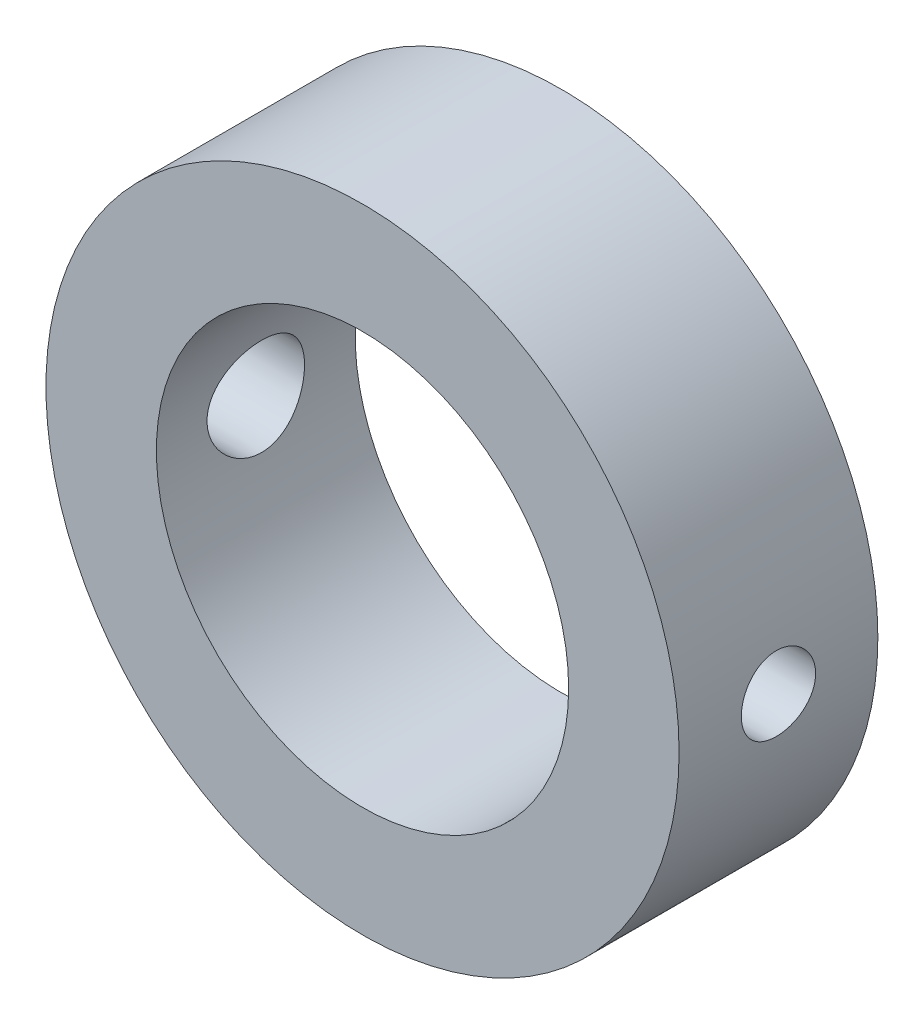
ISO-10303-21;
HEADER;
FILE_DESCRIPTION(('STEP AP214'),'2;1');
FILE_NAME('part.step','',(''),(''),'','','');
FILE_SCHEMA(('AUTOMOTIVE_DESIGN { 1 0 10303 214 1 1 1 1 }'));
ENDSEC;
DATA;
#1=APPLICATION_CONTEXT('core data for automotive mechanical design processes');
#2=APPLICATION_PROTOCOL_DEFINITION('international standard','automotive_design',2000,#1);
#3=PRODUCT_CONTEXT('',#1,'mechanical');
#4=PRODUCT('Part','Part','',(#3));
#5=PRODUCT_RELATED_PRODUCT_CATEGORY('part','',(#4));
#6=PRODUCT_DEFINITION_FORMATION('','',#4);
#7=PRODUCT_DEFINITION_CONTEXT('part definition',#1,'design');
#8=PRODUCT_DEFINITION('design','',#6,#7);
#9=PRODUCT_DEFINITION_SHAPE('','',#8);
#10=(LENGTH_UNIT() NAMED_UNIT(*) SI_UNIT(.MILLI.,.METRE.));
#11=(NAMED_UNIT(*) PLANE_ANGLE_UNIT() SI_UNIT($,.RADIAN.));
#12=(NAMED_UNIT(*) SI_UNIT($,.STERADIAN.) SOLID_ANGLE_UNIT());
#13=UNCERTAINTY_MEASURE_WITH_UNIT(LENGTH_MEASURE(1.E-05),#10,'distance_accuracy_value','');
#14=(GEOMETRIC_REPRESENTATION_CONTEXT(3) GLOBAL_UNCERTAINTY_ASSIGNED_CONTEXT((#13)) GLOBAL_UNIT_ASSIGNED_CONTEXT((#10,
#11,#12)) REPRESENTATION_CONTEXT('',''));
#15=CARTESIAN_POINT('',(0.,0.,0.));
#16=DIRECTION('',(0.,0.,1.));
#17=DIRECTION('',(1.,0.,0.));
#18=AXIS2_PLACEMENT_3D('',#15,#16,#17);
#19=CARTESIAN_POINT('',(0.,0.,13.5));
#20=DIRECTION('',(0.,0.,1.));
#21=DIRECTION('',(1.,0.,0.));
#22=AXIS2_PLACEMENT_3D('',#19,#20,#21);
#23=PLANE('',#22);
#24=CARTESIAN_POINT('',(0.,0.,13.5));
#25=DIRECTION('',(0.,0.,1.));
#26=DIRECTION('',(1.,0.,0.));
#27=AXIS2_PLACEMENT_3D('',#24,#25,#26);
#28=CIRCLE('',#27,43.);
#29=CARTESIAN_POINT('',(43.,0.,13.5));
#30=VERTEX_POINT('',#29);
#31=EDGE_CURVE('E10',#30,#30,#28,.T.);
#32=ORIENTED_EDGE('',*,*,#31,.T.);
#33=EDGE_LOOP('',(#32));
#34=FACE_BOUND('',#33,.T.);
#35=CARTESIAN_POINT('',(0.,0.,13.5));
#36=DIRECTION('',(0.,0.,1.));
#37=DIRECTION('',(1.,0.,0.));
#38=AXIS2_PLACEMENT_3D('',#35,#36,#37);
#39=CIRCLE('',#38,28.);
#40=CARTESIAN_POINT('',(28.,0.,13.5));
#41=VERTEX_POINT('',#40);
#42=EDGE_CURVE('E50',#41,#41,#39,.T.);
#43=ORIENTED_EDGE('',*,*,#42,.F.);
#44=EDGE_LOOP('',(#43));
#45=FACE_BOUND('',#44,.T.);
#46=ADVANCED_FACE('F31',(#34,#45),#23,.T.);
#47=CARTESIAN_POINT('',(0.,0.,-13.5));
#48=DIRECTION('',(0.,0.,1.));
#49=DIRECTION('',(1.,0.,0.));
#50=AXIS2_PLACEMENT_3D('',#47,#48,#49);
#51=PLANE('',#50);
#52=CARTESIAN_POINT('',(0.,0.,-13.5));
#53=DIRECTION('',(0.,0.,1.));
#54=DIRECTION('',(1.,0.,0.));
#55=AXIS2_PLACEMENT_3D('',#52,#53,#54);
#56=CIRCLE('',#55,43.);
#57=CARTESIAN_POINT('',(43.,0.,-13.5));
#58=VERTEX_POINT('',#57);
#59=EDGE_CURVE('E45',#58,#58,#56,.T.);
#60=ORIENTED_EDGE('',*,*,#59,.F.);
#61=EDGE_LOOP('',(#60));
#62=FACE_BOUND('',#61,.T.);
#63=CARTESIAN_POINT('',(0.,0.,-13.5));
#64=DIRECTION('',(0.,0.,1.));
#65=DIRECTION('',(1.,0.,0.));
#66=AXIS2_PLACEMENT_3D('',#63,#64,#65);
#67=CIRCLE('',#66,28.);
#68=CARTESIAN_POINT('',(28.,0.,-13.5));
#69=VERTEX_POINT('',#68);
#70=EDGE_CURVE('E53',#69,#69,#67,.T.);
#71=ORIENTED_EDGE('',*,*,#70,.T.);
#72=EDGE_LOOP('',(#71));
#73=FACE_BOUND('',#72,.T.);
#74=ADVANCED_FACE('F89',(#62,#73),#51,.F.);
#75=CARTESIAN_POINT('',(0.,0.,13.5));
#76=DIRECTION('',(0.,0.,-1.));
#77=DIRECTION('',(-1.,0.,0.));
#78=AXIS2_PLACEMENT_3D('',#75,#76,#77);
#79=CYLINDRICAL_SURFACE('',#78,43.);
#80=CARTESIAN_POINT('',(-42.7005537326384,-5.06583763321157,-4.75652361275826));
#81=CARTESIAN_POINT('',(-42.7163477142971,-4.93270891768627,-4.89882605603567));
#82=CARTESIAN_POINT('',(-42.7322168758354,-4.79362168722898,-5.03549192619008));
#83=CARTESIAN_POINT('',(-42.7636713832663,-4.50439373459468,-5.29670866597223));
#84=CARTESIAN_POINT('',(-42.7792566725748,-4.35425083813588,-5.42125714127135));
#85=CARTESIAN_POINT('',(-42.809711163048,-4.04387900362388,-5.65738814795436));
#86=CARTESIAN_POINT('',(-42.8245799023085,-3.88364370932299,-5.76896237962437));
#87=CARTESIAN_POINT('',(-42.8531786999786,-3.55421087977092,-5.9782990047526));
#88=CARTESIAN_POINT('',(-42.8669083482935,-3.38501015240699,-6.0760564327303));
#89=CARTESIAN_POINT('',(-42.892835023297,-3.03888405901492,-6.25699185876266));
#90=CARTESIAN_POINT('',(-42.9050321389534,-2.86195914220175,-6.34017070325558));
#91=CARTESIAN_POINT('',(-42.927549447541,-2.50161599003928,-6.49133653232323));
#92=CARTESIAN_POINT('',(-42.9378696320379,-2.31819772551478,-6.55932344862923));
#93=CARTESIAN_POINT('',(-42.9563369786926,-1.94622142896929,-6.67957144867405));
#94=CARTESIAN_POINT('',(-42.9644847018377,-1.75766473771525,-6.73183659263974));
#95=CARTESIAN_POINT('',(-42.9783778911905,-1.37672026031294,-6.82025985793493));
#96=CARTESIAN_POINT('',(-42.9841233231778,-1.18433241963132,-6.85641774981907));
#97=CARTESIAN_POINT('',(-42.9930049388914,-0.798952513846375,-6.91207729890392));
#98=CARTESIAN_POINT('',(-42.9961651628126,-0.605983163174101,-6.93173246347314));
#99=CARTESIAN_POINT('',(-42.9998779449146,-0.218983392092987,-6.95480764218464));
#100=CARTESIAN_POINT('',(-43.0004296028116,-0.0249526284897197,-6.9582220512225));
#101=CARTESIAN_POINT('',(-42.9989074538579,0.362629719975974,-6.94877534769905));
#102=CARTESIAN_POINT('',(-42.9968346171285,0.556181455415051,-6.9359202490183));
#103=CARTESIAN_POINT('',(-42.9901224583996,0.941554468225401,-6.89403764924919));
#104=CARTESIAN_POINT('',(-42.9854821888631,1.13337508012915,-6.86500417733982));
#105=CARTESIAN_POINT('',(-42.9738095772135,1.5124066684979,-6.79126491279672));
#106=CARTESIAN_POINT('',(-42.9667954637269,1.6996414463433,-6.7466784728129));
#107=CARTESIAN_POINT('',(-42.9505589327536,2.06973695286103,-6.64211179283036));
#108=CARTESIAN_POINT('',(-42.9413357088613,2.25259605738132,-6.58212593090902));
#109=CARTESIAN_POINT('',(-42.9209401860587,2.6125430124186,-6.44723677970186));
#110=CARTESIAN_POINT('',(-42.9097685397516,2.78963277182098,-6.37233848399163));
#111=CARTESIAN_POINT('',(-42.8857761675203,3.13696054904402,-6.20812715531531));
#112=CARTESIAN_POINT('',(-42.8729548281882,3.30719598714165,-6.11880875733702));
#113=CARTESIAN_POINT('',(-42.8459127026584,3.64087935291196,-5.92567074068454));
#114=CARTESIAN_POINT('',(-42.8316818935123,3.80426486567724,-5.82174467765523));
#115=CARTESIAN_POINT('',(-42.80229305683,4.12178927330786,-5.60062116341088));
#116=CARTESIAN_POINT('',(-42.7871346888704,4.27592473170252,-5.48341882607448));
#117=CARTESIAN_POINT('',(-42.7563174878935,4.57380914789874,-5.23661172412136));
#118=CARTESIAN_POINT('',(-42.7406588063775,4.71756120773187,-5.10701069072479));
#119=CARTESIAN_POINT('',(-42.709267263405,4.99377931167161,-4.83627508615798));
#120=CARTESIAN_POINT('',(-42.6935343765602,5.12624114472699,-4.69513624971417));
#121=CARTESIAN_POINT('',(-42.6465300316945,5.50815187385395,-4.25246951442392));
#122=CARTESIAN_POINT('',(-42.6157994436739,5.73891330775047,-3.93435293771481));
#123=CARTESIAN_POINT('',(-42.5593300301592,6.14373451377144,-3.26370479149895));
#124=CARTESIAN_POINT('',(-42.533591158311,6.31779481244524,-2.9111735416201));
#125=CARTESIAN_POINT('',(-42.4900654055851,6.60419513999488,-2.18176409086996));
#126=CARTESIAN_POINT('',(-42.4722702134176,6.71659970616295,-1.80491181144252));
#127=CARTESIAN_POINT('',(-42.4466757291218,6.87650957727948,-1.03737326404777));
#128=CARTESIAN_POINT('',(-42.438875676449,6.92401982014913,-0.646688050973389));
#129=CARTESIAN_POINT('',(-42.4342114387742,6.95254617164813,0.13303979740889));
#130=CARTESIAN_POINT('',(-42.4372330418092,6.93425672220834,0.522056457103814));
#131=CARTESIAN_POINT('',(-42.4536074165497,6.83328505587877,1.29140746802592));
#132=CARTESIAN_POINT('',(-42.4669600945035,6.75060342333027,1.6717418980097));
#133=CARTESIAN_POINT('',(-42.5024239416409,6.5235736539131,2.41219735408853));
#134=CARTESIAN_POINT('',(-42.5245165077609,6.37935644610632,2.77235947057431));
#135=CARTESIAN_POINT('',(-42.5749704925141,6.03343181523057,3.46345152452207));
#136=CARTESIAN_POINT('',(-42.6033323274233,5.83172057433244,3.79437951881149));
#137=CARTESIAN_POINT('',(-42.6634737880328,5.37416077077464,4.42110600576054));
#138=CARTESIAN_POINT('',(-42.6952842097319,5.11780058719192,4.71652807582918));
#139=CARTESIAN_POINT('',(-42.7585377993643,4.55919812584389,5.26030354673888));
#140=CARTESIAN_POINT('',(-42.7899809523067,4.25695398224773,5.50865503257221));
#141=CARTESIAN_POINT('',(-42.8491599699604,3.61308688567512,5.95251544579699));
#142=CARTESIAN_POINT('',(-42.8768748758372,3.27125989894034,6.14773147142776));
#143=CARTESIAN_POINT('',(-42.9252611298293,2.55913090516088,6.47776816482238));
#144=CARTESIAN_POINT('',(-42.9459329276022,2.18883071779952,6.61259268837209));
#145=CARTESIAN_POINT('',(-42.9777334585083,1.43381580453318,6.81678797463098));
#146=CARTESIAN_POINT('',(-42.9889470025088,1.04926217941175,6.88674100809512));
#147=CARTESIAN_POINT('',(-43.0008765395708,0.273706913386378,6.96109179599217));
#148=CARTESIAN_POINT('',(-43.0015933166557,-0.117294243755138,6.96549444650822));
#149=CARTESIAN_POINT('',(-42.9925075583907,-0.889993939428825,6.90896956730961));
#150=CARTESIAN_POINT('',(-42.9828212935386,-1.27174753716035,6.84876414139727));
#151=CARTESIAN_POINT('',(-42.9541647117393,-2.01982295996605,6.66588044137355));
#152=CARTESIAN_POINT('',(-42.935194239684,-2.38614452711156,6.54320112353106));
#153=CARTESIAN_POINT('',(-42.9013496600983,-2.9165132070068,6.31510856135504));
#154=CARTESIAN_POINT('',(-42.8891405030438,-3.09044172895857,6.23152310023267));
#155=CARTESIAN_POINT('',(-42.8632674728434,-3.43064149443909,6.05022910127554));
#156=CARTESIAN_POINT('',(-42.8496041173996,-3.59691543303934,5.95252558513867));
#157=CARTESIAN_POINT('',(-42.8211883329577,-3.92075182527211,5.74363640086512));
#158=CARTESIAN_POINT('',(-42.8064354426985,-4.07831053931872,5.63244500960731));
#159=CARTESIAN_POINT('',(-42.7762552988375,-4.38354773446006,5.39742545393037));
#160=CARTESIAN_POINT('',(-42.7608282844426,-4.53122967391877,5.27360175148989));
#161=CARTESIAN_POINT('',(-42.729513676828,-4.81764378889772,5.01243756652414));
#162=CARTESIAN_POINT('',(-42.7136226999927,-4.95623394835483,4.87494172044946));
#163=CARTESIAN_POINT('',(-42.6820289508073,-5.22132367301294,4.58882402868624));
#164=CARTESIAN_POINT('',(-42.6663261129924,-5.34782755730743,4.44020619161202));
#165=CARTESIAN_POINT('',(-42.6355390029776,-5.58797638330125,4.13276343602957));
#166=CARTESIAN_POINT('',(-42.6204549811323,-5.70161615264222,3.97393445181963));
#167=CARTESIAN_POINT('',(-42.5913452620942,-5.91514326250388,3.64727925122618));
#168=CARTESIAN_POINT('',(-42.5773191726076,-6.01503571213652,3.47945640975104));
#169=CARTESIAN_POINT('',(-42.5506545861169,-6.20085901525531,3.13508482172751));
#170=CARTESIAN_POINT('',(-42.5380231593957,-6.2867197020903,2.95849765310593));
#171=CARTESIAN_POINT('',(-42.5145977186562,-6.44323244926257,2.59866314968147));
#172=CARTESIAN_POINT('',(-42.5038030577857,-6.51388986605133,2.41541818725214));
#173=CARTESIAN_POINT('',(-42.4843605742948,-6.63951434911613,2.04349264274926));
#174=CARTESIAN_POINT('',(-42.4757129813666,-6.69447973676234,1.854811481522));
#175=CARTESIAN_POINT('',(-42.4608215662475,-6.78829071457594,1.47339543938932));
#176=CARTESIAN_POINT('',(-42.4545776654502,-6.8271368318846,1.28066069126314));
#177=CARTESIAN_POINT('',(-42.4447235506245,-6.88813396682107,0.894294461705327));
#178=CARTESIAN_POINT('',(-42.4410899628025,-6.91043321275083,0.70068696879016));
#179=CARTESIAN_POINT('',(-42.4364712196046,-6.93874032714306,0.312256620904995));
#180=CARTESIAN_POINT('',(-42.4354860062117,-6.94474855248691,0.117433792652614));
#181=CARTESIAN_POINT('',(-42.4361929382048,-6.94042747468007,-0.272091059641655));
#182=CARTESIAN_POINT('',(-42.4378859835438,-6.93009267991946,-0.466793021075163));
#183=CARTESIAN_POINT('',(-42.4439002640215,-6.89316176428747,-0.85453456607113));
#184=CARTESIAN_POINT('',(-42.4482205267315,-6.8665716600775,-1.04757473792393));
#185=CARTESIAN_POINT('',(-42.4593278677754,-6.79755018203065,-1.42950935307062));
#186=CARTESIAN_POINT('',(-42.4660997149843,-6.75521657559763,-1.61842191846674));
#187=CARTESIAN_POINT('',(-42.4819159631627,-6.65502698490722,-1.99191247960682));
#188=CARTESIAN_POINT('',(-42.4909595479354,-6.59717657506912,-2.17649200615013));
#189=CARTESIAN_POINT('',(-42.5110571562871,-6.46640471875321,-2.54000279911698));
#190=CARTESIAN_POINT('',(-42.5221100091405,-6.39349204513934,-2.7189372838188));
#191=CARTESIAN_POINT('',(-42.5459122947484,-6.23312988277321,-3.06998702159453));
#192=CARTESIAN_POINT('',(-42.5586614149867,-6.14568307101798,-3.24210352323521));
#193=CARTESIAN_POINT('',(-42.5914909061707,-5.91472246242306,-3.65339526876705));
#194=CARTESIAN_POINT('',(-42.6123068269294,-5.76358750614786,-3.88828086508098));
#195=CARTESIAN_POINT('',(-42.6555485079447,-5.43430723789612,-4.33812576837739));
#196=CARTESIAN_POINT('',(-42.6779742931483,-5.25616150730101,-4.55308476645011));
#197=CARTESIAN_POINT('',(-42.7005537326384,-5.06583763321157,-4.75652361275826));
#198=B_SPLINE_CURVE_WITH_KNOTS('',3,(#80,#81,#82,#83,#84,#85,#86,#87,#88,#89,#90,#91,#92,#93,
#94,#95,#96,#97,#98,#99,#100,#101,#102,#103,#104,#105,#106,#107,#108,#109,#110,#111,#112,#113,
#114,#115,#116,#117,#118,#119,#120,#121,#122,#123,#124,#125,#126,#127,#128,#129,#130,#131,#132,
#133,#134,#135,#136,#137,#138,#139,#140,#141,#142,#143,#144,#145,#146,#147,#148,#149,#150,#151,
#152,#153,#154,#155,#156,#157,#158,#159,#160,#161,#162,#163,#164,#165,#166,#167,#168,#169,#170,
#171,#172,#173,#174,#175,#176,#177,#178,#179,#180,#181,#182,#183,#184,#185,#186,#187,#188,#189,
#190,#191,#192,#193,#194,#195,#196,#197),.UNSPECIFIED.,.T.,.F.,(4,2,2,2,2,2,2,2,2,2,2,2,2,2,2,2,
2,2,2,2,2,2,2,2,2,2,2,2,2,2,2,2,2,2,2,2,2,2,2,2,2,2,2,2,2,2,2,2,2,2,2,2,2,2,2,2,2,2,4),(0.,
0.586279381729272,1.17267437466221,1.75944244858957,2.34642086183849,2.93336518359362,
3.52031214287664,4.10710738975487,4.69391099517486,5.27519373687236,5.85667707971634,
6.43794554511571,7.01942867677223,7.59654429143831,8.17387089615041,8.75100450151222,
9.32835332689378,9.91015128557391,10.4921640657047,11.0740022446264,11.6560564976213,
12.8325686179175,14.0090698123412,15.1843371587282,16.3595150720089,17.5223268548681,
18.6851280856546,19.8454674690084,21.0058839214036,22.1776828034979,23.349529348533,
24.5277104076118,25.7058162332317,26.8732423142677,28.0405811975856,29.1950076923386,
30.3494534743546,30.928970664335,31.5082822290194,32.0878404704055,32.6671947046726,
33.2541127258479,33.8408202181033,34.4277627799923,35.0144866155767,35.6040601166074,
36.1934255563653,36.7828540189489,37.3722632041984,37.9563264695242,38.5403769398882,
39.1246237056081,39.7086543518844,40.2891171279131,40.8693716510579,41.4492891588773,
42.0290999716502,42.8672454709393,43.7054039613085),.UNSPECIFIED.);
#199=CARTESIAN_POINT('',(-42.7005537326384,-5.06583763321157,-4.75652361275826));
#200=VERTEX_POINT('',#199);
#201=EDGE_CURVE('E78',#200,#200,#198,.T.);
#202=ORIENTED_EDGE('',*,*,#201,.T.);
#203=EDGE_LOOP('',(#202));
#204=FACE_BOUND('',#203,.T.);
#205=CARTESIAN_POINT('',(42.8450778167732,-3.64682147556575,-3.49025183929215));
#206=CARTESIAN_POINT('',(42.8284052634707,-3.84270281304771,-3.28610304186815));
#207=CARTESIAN_POINT('',(42.8118308624207,-4.02150978269098,-3.06531691471084));
#208=CARTESIAN_POINT('',(42.7807456953999,-4.33976036569698,-2.59662704307012));
#209=CARTESIAN_POINT('',(42.7662370633358,-4.47916341975614,-2.34869571888185));
#210=CARTESIAN_POINT('',(42.740944328393,-4.71441751625268,-1.83279276751176));
#211=CARTESIAN_POINT('',(42.7301597547715,-4.81027406370656,-1.56482367843384));
#212=CARTESIAN_POINT('',(42.713552691985,-4.9555850036366,-1.01650642462639));
#213=CARTESIAN_POINT('',(42.7077289556008,-5.00505105960333,-0.736161390025225));
#214=CARTESIAN_POINT('',(42.7017269249508,-5.056004852695,-0.172576460096183));
#215=CARTESIAN_POINT('',(42.701519030782,-5.05774414813439,0.110640382671392));
#216=CARTESIAN_POINT('',(42.7066972100329,-5.01382965045466,0.6733277859546));
#217=CARTESIAN_POINT('',(42.7120833876107,-4.96817497488941,0.952798276617357));
#218=CARTESIAN_POINT('',(42.7278119188251,-4.83102347947984,1.49928090943108));
#219=CARTESIAN_POINT('',(42.738140642398,-4.73965269958097,1.76632511057098));
#220=CARTESIAN_POINT('',(42.7625831006916,-4.51379203685135,2.28132057924534));
#221=CARTESIAN_POINT('',(42.7766969603342,-4.37930073087309,2.52927121628183));
#222=CARTESIAN_POINT('',(42.8072192429006,-4.07015410968457,3.0005614928078));
#223=CARTESIAN_POINT('',(42.8236400617523,-3.89527829298692,3.22375567618113));
#224=CARTESIAN_POINT('',(42.8568798576623,-3.51069945365964,3.63776575299907));
#225=CARTESIAN_POINT('',(42.8736988489793,-3.30099518219499,3.82858048492576));
#226=CARTESIAN_POINT('',(42.9059588020538,-2.85126732015996,4.17355499093786));
#227=CARTESIAN_POINT('',(42.9213911248987,-2.61107350541076,4.32749375763553));
#228=CARTESIAN_POINT('',(42.9490315252948,-2.10809102907965,4.59289161767846));
#229=CARTESIAN_POINT('',(42.9612396424209,-1.84530264488367,4.70435123243476));
#230=CARTESIAN_POINT('',(42.9810403182878,-1.30501726653396,4.8814219092413));
#231=CARTESIAN_POINT('',(42.9886404433903,-1.02754520231362,4.94710815818));
#232=CARTESIAN_POINT('',(42.9983995369068,-0.465423461964856,5.03099461098548));
#233=CARTESIAN_POINT('',(43.0005586989774,-0.180774041659322,5.04919650493087));
#234=CARTESIAN_POINT('',(42.9991962987622,0.38606002144163,5.03760916567349));
#235=CARTESIAN_POINT('',(42.9957039193086,0.668249809515231,5.00806647195478));
#236=CARTESIAN_POINT('',(42.9834842773634,1.22362678426536,4.90232272776897));
#237=CARTESIAN_POINT('',(42.9747569982919,1.49681394242617,4.82612152952662));
#238=CARTESIAN_POINT('',(42.9530382604789,2.02653701863684,4.62925026888157));
#239=CARTESIAN_POINT('',(42.9400459670476,2.28306966551563,4.508571501376));
#240=CARTESIAN_POINT('',(42.9112406997147,2.77228172607562,4.22617489253425));
#241=CARTESIAN_POINT('',(42.8954276209103,3.00496025213245,4.06445552483339));
#242=CARTESIAN_POINT('',(42.8626487181207,3.44115057914487,3.7035456717729));
#243=CARTESIAN_POINT('',(42.8456773096705,3.64450385313167,3.50416406563709));
#244=CARTESIAN_POINT('',(42.8125613390358,4.01487938966739,3.07404459127868));
#245=CARTESIAN_POINT('',(42.796416786294,4.18190123737511,2.84330636506732));
#246=CARTESIAN_POINT('',(42.7667604789871,4.47504375101313,2.35659228679505));
#247=CARTESIAN_POINT('',(42.7532521557072,4.60111125115162,2.10058418745143));
#248=CARTESIAN_POINT('',(42.7304417598534,4.80835603810036,1.57082495409823));
#249=CARTESIAN_POINT('',(42.7211395067477,4.88953525162692,1.29707458219445));
#250=CARTESIAN_POINT('',(42.7078569108299,5.00422898414307,0.741382544935385));
#251=CARTESIAN_POINT('',(42.7038444330863,5.03803139315551,0.459501071281104));
#252=CARTESIAN_POINT('',(42.7014978968841,5.05788370500376,-0.105956827652731));
#253=CARTESIAN_POINT('',(42.7031636388346,5.04393528629294,-0.389533193006659));
#254=CARTESIAN_POINT('',(42.7119575907571,4.96890975045096,-0.948764647902921));
#255=CARTESIAN_POINT('',(42.7190570394025,4.90808076658166,-1.22445354184842));
#256=CARTESIAN_POINT('',(42.737877935792,4.74138889569483,-1.76169239631055));
#257=CARTESIAN_POINT('',(42.7495994738493,4.63552512871686,-2.0232420804405));
#258=CARTESIAN_POINT('',(42.7763899576777,4.38141068262318,-2.52573619750615));
#259=CARTESIAN_POINT('',(42.7914695568128,4.2330246631535,-2.76661159526277));
#260=CARTESIAN_POINT('',(42.8232664902144,3.89820966220688,-3.22016809928309));
#261=CARTESIAN_POINT('',(42.8399838999621,3.7117789269492,-3.4328479050439));
#262=CARTESIAN_POINT('',(42.8733167187432,3.30463737669724,-3.82553898694723));
#263=CARTESIAN_POINT('',(42.8899305928969,3.08369557404668,-4.00531097949286));
#264=CARTESIAN_POINT('',(42.9210741768023,2.61467791687465,-4.3252940848098));
#265=CARTESIAN_POINT('',(42.9356038720882,2.36660187404033,-4.46550492300072));
#266=CARTESIAN_POINT('',(42.9609634512037,1.84999888836495,-4.70250146282159));
#267=CARTESIAN_POINT('',(42.9717893376465,1.58145022988014,-4.79924028173934));
#268=CARTESIAN_POINT('',(42.9884980201489,1.03178481237131,-4.94624530693175));
#269=CARTESIAN_POINT('',(42.9943811575161,0.750668922554261,-4.99651472204477));
#270=CARTESIAN_POINT('',(43.0005245080175,0.185387579437961,-5.0489700151855));
#271=CARTESIAN_POINT('',(43.0008134664055,-0.0987547733598434,-5.05140170469162));
#272=CARTESIAN_POINT('',(42.9958087288678,-0.663459768349335,-5.00872864236133));
#273=CARTESIAN_POINT('',(42.9905139182098,-0.944021684430806,-4.9636143985541));
#274=CARTESIAN_POINT('',(42.9749495119242,-1.49300461955577,-4.82730325764909));
#275=CARTESIAN_POINT('',(42.9646888682769,-1.76144653908355,-4.73618927225504));
#276=CARTESIAN_POINT('',(42.940343568851,-2.27902399499867,-4.51058662727642));
#277=CARTESIAN_POINT('',(42.9262627553637,-2.52817860847352,-4.37614152432683));
#278=CARTESIAN_POINT('',(42.9007288733169,-2.92462870236063,-4.11728202788451));
#279=CARTESIAN_POINT('',(42.889878976774,-3.07898603387242,-4.00345088093643));
#280=CARTESIAN_POINT('',(42.867696999786,-3.37377792170557,-3.75903886803124));
#281=CARTESIAN_POINT('',(42.8563649161414,-3.51421238561867,-3.62845789091605));
#282=CARTESIAN_POINT('',(42.8450778167732,-3.64682147556575,-3.49025183929215));
#283=B_SPLINE_CURVE_WITH_KNOTS('',3,(#205,#206,#207,#208,#209,#210,#211,#212,#213,#214,#215,
#216,#217,#218,#219,#220,#221,#222,#223,#224,#225,#226,#227,#228,#229,#230,#231,#232,#233,#234,
#235,#236,#237,#238,#239,#240,#241,#242,#243,#244,#245,#246,#247,#248,#249,#250,#251,#252,#253,
#254,#255,#256,#257,#258,#259,#260,#261,#262,#263,#264,#265,#266,#267,#268,#269,#270,#271,#272,
#273,#274,#275,#276,#277,#278,#279,#280,#281,#282),.UNSPECIFIED.,.T.,.F.,(4,2,2,2,2,2,2,2,2,2,2,
2,2,2,2,2,2,2,2,2,2,2,2,2,2,2,2,2,2,2,2,2,2,2,2,2,2,2,4),(0.,0.849553475791305,1.69997825718332,
2.55029550053183,3.40039889988469,4.24602070680345,5.0916582589544,5.93497711828585,
6.77832381333333,7.62638890170345,8.47448440549501,9.32754226524078,10.1805896537768,
11.032232510868,11.8838450555961,12.7310741483573,13.5783059244479,14.4257036079791,
15.2731328121876,16.1249838949315,16.9768447038111,17.8298069960958,18.6827326742863,
19.5304526538991,20.3781428362515,21.2213768509059,22.06462734275,22.9105921333778,
23.7565959300019,24.6085260863016,25.4604621554104,26.3133148089992,27.1661085663992,
28.0145191396623,28.8630991199304,29.710155018677,30.5563620948245,31.1314948106665,
31.7066313434995),.UNSPECIFIED.);
#284=CARTESIAN_POINT('',(42.8450778167732,-3.64682147556575,-3.49025183929215));
#285=VERTEX_POINT('',#284);
#286=EDGE_CURVE('E73',#285,#285,#283,.T.);
#287=ORIENTED_EDGE('',*,*,#286,.T.);
#288=EDGE_LOOP('',(#287));
#289=FACE_BOUND('',#288,.T.);
#290=ORIENTED_EDGE('',*,*,#31,.F.);
#291=EDGE_LOOP('',(#290));
#292=FACE_BOUND('',#291,.T.);
#293=ORIENTED_EDGE('',*,*,#59,.T.);
#294=EDGE_LOOP('',(#293));
#295=FACE_BOUND('',#294,.T.);
#296=ADVANCED_FACE('F33',(#204,#289,#292,#295),#79,.T.);
#297=CARTESIAN_POINT('',(0.,0.,13.5));
#298=DIRECTION('',(0.,0.,-1.));
#299=DIRECTION('',(-1.,0.,0.));
#300=AXIS2_PLACEMENT_3D('',#297,#298,#299);
#301=CYLINDRICAL_SURFACE('',#300,28.);
#302=CARTESIAN_POINT('',(-27.5845410268873,-4.80552768548586,-4.54296574572551));
#303=CARTESIAN_POINT('',(-27.6287135819169,-4.55195121914281,-4.81261349558643));
#304=CARTESIAN_POINT('',(-27.6732371775066,-4.27563879124583,-5.06100766649041));
#305=CARTESIAN_POINT('',(-27.758086532114,-3.68478530809807,-5.50839959587149));
#306=CARTESIAN_POINT('',(-27.7984098773779,-3.37022249411174,-5.70736904143791));
#307=CARTESIAN_POINT('',(-27.8704144752048,-2.71105985696501,-6.05011469762767));
#308=CARTESIAN_POINT('',(-27.902089253746,-2.36643778569372,-6.19384959416372));
#309=CARTESIAN_POINT('',(-27.9531798061328,-1.65710770923159,-6.42126855662243));
#310=CARTESIAN_POINT('',(-27.9725989640512,-1.29240527898012,-6.50496920032411));
#311=CARTESIAN_POINT('',(-27.9967347034249,-0.560629580405376,-6.6085188618452));
#312=CARTESIAN_POINT('',(-28.0017229139719,-0.193732191958525,-6.62954776192661));
#313=CARTESIAN_POINT('',(-27.997216662051,0.538357152796313,-6.61038872095766));
#314=CARTESIAN_POINT('',(-27.987723031768,0.903549205890152,-6.57020429747125));
#315=CARTESIAN_POINT('',(-27.9555473050703,1.6164759741348,-6.43100395180013));
#316=CARTESIAN_POINT('',(-27.9330549072033,1.96438521311829,-6.33283380360838));
#317=CARTESIAN_POINT('',(-27.8774346547281,2.63879356847422,-6.08145303412582));
#318=CARTESIAN_POINT('',(-27.8443058571262,2.96529078342409,-5.92823753252332));
#319=CARTESIAN_POINT('',(-27.7702774010388,3.59353219510737,-5.56830044227301));
#320=CARTESIAN_POINT('',(-27.7292594761347,3.89478403478159,-5.36074448728545));
#321=CARTESIAN_POINT('',(-27.6441817537651,4.45877846466099,-4.89911307974947));
#322=CARTESIAN_POINT('',(-27.6001214704602,4.72151488325376,-4.64503018648242));
#323=CARTESIAN_POINT('',(-27.5126130299141,5.20756042050317,-4.09035501214128));
#324=CARTESIAN_POINT('',(-27.4692050305493,5.42977026667944,-3.78879174945993));
#325=CARTESIAN_POINT('',(-27.3890615932629,5.82058897692478,-3.15190685181148));
#326=CARTESIAN_POINT('',(-27.3523260241849,5.98919889462872,-2.81658588060357));
#327=CARTESIAN_POINT('',(-27.2899210427998,6.26742523015193,-2.12225555178564));
#328=CARTESIAN_POINT('',(-27.2642246581791,6.37718560135215,-1.76330643137507));
#329=CARTESIAN_POINT('',(-27.2268936214812,6.53474797156585,-1.03136944635683));
#330=CARTESIAN_POINT('',(-27.2152564437773,6.58256109902982,-0.658384115662326));
#331=CARTESIAN_POINT('',(-27.2075736454213,6.61424026589609,0.0816180481924415));
#332=CARTESIAN_POINT('',(-27.2111671408684,6.5995863847538,0.4485684599782));
#333=CARTESIAN_POINT('',(-27.2326961297137,6.51017151445314,1.17462127040212));
#334=CARTESIAN_POINT('',(-27.250631347162,6.43541168179719,1.53372381990495));
#335=CARTESIAN_POINT('',(-27.298600467677,6.22876259254804,2.23205080228881));
#336=CARTESIAN_POINT('',(-27.3285678483951,6.09718715596889,2.57137297190569));
#337=CARTESIAN_POINT('',(-27.3972223173064,5.78085522541102,3.22329407880135));
#338=CARTESIAN_POINT('',(-27.4359105726876,5.59609161189321,3.53588943127393));
#339=CARTESIAN_POINT('',(-27.5186856536234,5.17388372972931,4.1327591871688));
#340=CARTESIAN_POINT('',(-27.5628709858664,4.93538838621642,4.41627659736511));
#341=CARTESIAN_POINT('',(-27.651080021984,4.41445728657495,4.93964656565523));
#342=CARTESIAN_POINT('',(-27.6951037088912,4.1320170454654,5.17949466146554));
#343=CARTESIAN_POINT('',(-27.7787499709229,3.52641430471731,5.61189947136048));
#344=CARTESIAN_POINT('',(-27.8183042676259,3.20274856743796,5.80376596281679));
#345=CARTESIAN_POINT('',(-27.8878310591187,2.52669181011822,6.13004663741924));
#346=CARTESIAN_POINT('',(-27.9178047690708,2.17430444013319,6.26446810738607));
#347=CARTESIAN_POINT('',(-27.9643237291122,1.45719053550445,6.46966781909651));
#348=CARTESIAN_POINT('',(-27.9810913748009,1.09278106413335,6.5415023544226));
#349=CARTESIAN_POINT('',(-28.000146010011,0.356722610069916,6.62296510408438));
#350=CARTESIAN_POINT('',(-28.0024352763984,-0.0149252250979495,6.63260309943624));
#351=CARTESIAN_POINT('',(-27.9923988910091,-0.745742650283554,6.58986732570784));
#352=CARTESIAN_POINT('',(-27.9804108067413,-1.10500178725262,6.53892591152073));
#353=CARTESIAN_POINT('',(-27.9436857397439,-1.8096895299942,6.37909274670984));
#354=CARTESIAN_POINT('',(-27.9189484430945,-2.15511779498792,6.27019956915644));
#355=CARTESIAN_POINT('',(-27.8592371031233,-2.82424163586957,5.99726740674926));
#356=CARTESIAN_POINT('',(-27.8242186019011,-3.14783515968673,5.83298845570181));
#357=CARTESIAN_POINT('',(-27.7476849622915,-3.76328156056478,5.45416660240848));
#358=CARTESIAN_POINT('',(-27.7061688086153,-4.05512946512246,5.2396158423461));
#359=CARTESIAN_POINT('',(-27.6198799143591,-4.60676341897435,4.75990981299455));
#360=CARTESIAN_POINT('',(-27.5750509789412,-4.86553599442058,4.49359847563812));
#361=CARTESIAN_POINT('',(-27.4880508122847,-5.33519050859353,3.9212350529311));
#362=CARTESIAN_POINT('',(-27.4458798023868,-5.54606846265706,3.61517966434288));
#363=CARTESIAN_POINT('',(-27.3685274790965,-5.91607626025018,2.96793256708625));
#364=CARTESIAN_POINT('',(-27.3334263596287,-6.07462414982657,2.62639785609869));
#365=CARTESIAN_POINT('',(-27.2749772849971,-6.33191651765475,1.92056394437079));
#366=CARTESIAN_POINT('',(-27.2516273073985,-6.43067128722004,1.55626867298636));
#367=CARTESIAN_POINT('',(-27.2198564620843,-6.56384508224113,0.822661608908199));
#368=CARTESIAN_POINT('',(-27.2111592065447,-6.59945585876517,0.453578206921137));
#369=CARTESIAN_POINT('',(-27.2088899877966,-6.60880843620292,-0.285440447690415));
#370=CARTESIAN_POINT('',(-27.2153181224884,-6.5825498366618,-0.655375705813133));
#371=CARTESIAN_POINT('',(-27.2422829295895,-6.47002431231382,-1.37905459767354));
#372=CARTESIAN_POINT('',(-27.262581720765,-6.38476887280764,-1.73296558733389));
#373=CARTESIAN_POINT('',(-27.3146894771559,-6.15801665028562,-2.42123249674784));
#374=CARTESIAN_POINT('',(-27.346493256063,-6.0165452059344,-2.75559714898658));
#375=CARTESIAN_POINT('',(-27.4121031464995,-5.70936570861722,-3.34291763857842));
#376=CARTESIAN_POINT('',(-27.4447045754749,-5.55155613315954,-3.6001831963666));
#377=CARTESIAN_POINT('',(-27.5129735978821,-5.20268069874876,-4.09063476654084));
#378=CARTESIAN_POINT('',(-27.5486413805785,-5.01161278624243,-4.32381929061366));
#379=CARTESIAN_POINT('',(-27.5845410268873,-4.80552768548586,-4.54296574572551));
#380=B_SPLINE_CURVE_WITH_KNOTS('',3,(#302,#303,#304,#305,#306,#307,#308,#309,#310,#311,#312,
#313,#314,#315,#316,#317,#318,#319,#320,#321,#322,#323,#324,#325,#326,#327,#328,#329,#330,#331,
#332,#333,#334,#335,#336,#337,#338,#339,#340,#341,#342,#343,#344,#345,#346,#347,#348,#349,#350,
#351,#352,#353,#354,#355,#356,#357,#358,#359,#360,#361,#362,#363,#364,#365,#366,#367,#368,#369,
#370,#371,#372,#373,#374,#375,#376,#377,#378,#379),.UNSPECIFIED.,.T.,.F.,(4,2,2,2,2,2,2,2,2,2,2,
2,2,2,2,2,2,2,2,2,2,2,2,2,2,2,2,2,2,2,2,2,2,2,2,2,2,2,4),(0.,1.1172628955525,2.23516434580955,
3.35390033889689,4.47232728664969,5.56956094575561,6.66673155577764,7.74828092684535,
8.82992621156984,9.92926754379231,11.0287848395531,12.1547260644483,13.2806451549056,
14.4037973932378,15.5267478360233,16.6232410955761,17.7197132579373,18.8102050279742,
19.900842834445,21.0150231936893,22.1293173399669,23.2588217290591,24.3881827995397,
25.4980921200294,26.6078268921339,27.691836195112,28.7758721905748,29.8646665979418,
30.953631304744,32.0705065131008,33.1874746075167,34.3164757512771,35.4452825213364,
36.5525483708029,37.6598213871623,38.748566153861,39.836820738045,40.7447796609381,
41.652794666124),.UNSPECIFIED.);
#381=CARTESIAN_POINT('',(-27.5845410268873,-4.80552768548586,-4.54296574572551));
#382=VERTEX_POINT('',#381);
#383=EDGE_CURVE('E36',#382,#382,#380,.T.);
#384=ORIENTED_EDGE('',*,*,#383,.F.);
#385=EDGE_LOOP('',(#384));
#386=FACE_BOUND('',#385,.T.);
#387=CARTESIAN_POINT('',(27.7191644719397,-3.95574531252415,-3.65236018970873));
#388=CARTESIAN_POINT('',(27.6899845586571,-4.16022244238231,-3.43184028086141));
#389=CARTESIAN_POINT('',(27.6611186063888,-4.34629953104162,-3.19402612201942));
#390=CARTESIAN_POINT('',(27.6072449859547,-4.67633789018991,-2.69018954431966));
#391=CARTESIAN_POINT('',(27.5822401415735,-4.82026840549158,-2.42414671834878));
#392=CARTESIAN_POINT('',(27.5389576891603,-5.06171265987807,-1.87107109114293));
#393=CARTESIAN_POINT('',(27.5206830766632,-5.15920573593753,-1.58402901138964));
#394=CARTESIAN_POINT('',(27.4930358421786,-5.30457612337013,-0.997286854632879));
#395=CARTESIAN_POINT('',(27.4836609044891,-5.35246634173933,-0.697590091597908));
#396=CARTESIAN_POINT('',(27.4749899679859,-5.3967984819533,-0.0984151072546179));
#397=CARTESIAN_POINT('',(27.4755574195956,-5.39393741920427,0.201009672526944));
#398=CARTESIAN_POINT('',(27.486369409448,-5.33856458354156,0.795048971821968));
#399=CARTESIAN_POINT('',(27.4966139276154,-5.2860529136281,1.08966350131301));
#400=CARTESIAN_POINT('',(27.5254939861944,-5.13352681976945,1.66392786537699));
#401=CARTESIAN_POINT('',(27.5440777883215,-5.03380508809973,1.94365825130787));
#402=CARTESIAN_POINT('',(27.5875244342324,-4.78996386506971,2.48251694278693));
#403=CARTESIAN_POINT('',(27.612387838349,-4.64584041146537,2.74164340712072));
#404=CARTESIAN_POINT('',(27.6660691803874,-4.31475070843724,3.23623034963806));
#405=CARTESIAN_POINT('',(27.6949414879126,-4.12716648511096,3.47127118565996));
#406=CARTESIAN_POINT('',(27.7531548840189,-3.71557593998274,3.90689529016892));
#407=CARTESIAN_POINT('',(27.7824960150087,-3.49156630619941,4.10747542190169));
#408=CARTESIAN_POINT('',(27.8388403566757,-3.00973731183618,4.47134298682859));
#409=CARTESIAN_POINT('',(27.8658048234938,-2.75148623973133,4.63406545012889));
#410=CARTESIAN_POINT('',(27.9138996402461,-2.21082874134602,4.91385243859322));
#411=CARTESIAN_POINT('',(27.9350302658648,-1.92842345732572,5.03091912137919));
#412=CARTESIAN_POINT('',(27.968964177652,-1.34929059775677,5.21527369715743));
#413=CARTESIAN_POINT('',(27.9818192827972,-1.05266489495576,5.28287172110764));
#414=CARTESIAN_POINT('',(27.9979617398505,-0.452033304504614,5.36736414544649));
#415=CARTESIAN_POINT('',(28.0012500339638,-0.148028146607627,5.3842635389887));
#416=CARTESIAN_POINT('',(27.9979137296585,0.454092825640762,5.36695583026301));
#417=CARTESIAN_POINT('',(27.991430333974,0.752230657033575,5.33347671790861));
#418=CARTESIAN_POINT('',(27.9695261090072,1.33854766542565,5.21779267739316));
#419=CARTESIAN_POINT('',(27.9541051973555,1.62672675061798,5.13558730016484));
#420=CARTESIAN_POINT('',(27.9159920892438,2.18538938191161,4.92482278323702));
#421=CARTESIAN_POINT('',(27.8932927997284,2.45585535499108,4.79621841058558));
#422=CARTESIAN_POINT('',(27.8430838267582,2.97151238534776,4.49634353567557));
#423=CARTESIAN_POINT('',(27.8155736688983,3.21670094619801,4.3250688249404));
#424=CARTESIAN_POINT('',(27.7582837408179,3.67868785444341,3.94169620396321));
#425=CARTESIAN_POINT('',(27.7284765147137,3.89501497450999,3.729034290496));
#426=CARTESIAN_POINT('',(27.6702724420781,4.28903133956925,3.27031943697469));
#427=CARTESIAN_POINT('',(27.6418756549319,4.46671895874445,3.02426509258898));
#428=CARTESIAN_POINT('',(27.589582141323,4.77914883285248,2.50416867047907));
#429=CARTESIAN_POINT('',(27.5657075609786,4.91368187063196,2.22999850314539));
#430=CARTESIAN_POINT('',(27.525431877254,5.13451973692995,1.66236395079083));
#431=CARTESIAN_POINT('',(27.5090299073237,5.22083015777448,1.36890180745351));
#432=CARTESIAN_POINT('',(27.4858498047177,5.34151830856673,0.775804030814627));
#433=CARTESIAN_POINT('',(27.4789281320896,5.3766711325788,0.476331772429624));
#434=CARTESIAN_POINT('',(27.4750651466078,5.39637962947731,-0.124323333706605));
#435=CARTESIAN_POINT('',(27.4781229439746,5.38093981325324,-0.425506026563574));
#436=CARTESIAN_POINT('',(27.4937424649363,5.30054019882241,-1.01670482143189));
#437=CARTESIAN_POINT('',(27.5061736872289,5.23626028245441,-1.30681729249375));
#438=CARTESIAN_POINT('',(27.5389585240908,5.06099274825638,-1.87209069133583));
#439=CARTESIAN_POINT('',(27.5593125632182,4.95000262735105,-2.14725081696738));
#440=CARTESIAN_POINT('',(27.6058625008811,4.68345261976432,-2.67747019730631));
#441=CARTESIAN_POINT('',(27.6321067427139,4.52752068142266,-2.93233800130515));
#442=CARTESIAN_POINT('',(27.6874291845341,4.17586629263786,-3.41262360447898));
#443=CARTESIAN_POINT('',(27.7165077052155,3.98013933672697,-3.63803806428721));
#444=CARTESIAN_POINT('',(27.7748628332487,3.55031927611471,-4.05725020887641));
#445=CARTESIAN_POINT('',(27.8041336337181,3.31560080863123,-4.25040805495183));
#446=CARTESIAN_POINT('',(27.8590849139398,2.81678053448003,-4.59475560842305));
#447=CARTESIAN_POINT('',(27.8847653542411,2.55267840499931,-4.74594485468218));
#448=CARTESIAN_POINT('',(27.9297115641116,2.00189800184093,-5.00220937502346));
#449=CARTESIAN_POINT('',(27.9489664719362,1.71518250354987,-5.10720666043035));
#450=CARTESIAN_POINT('',(27.9788234828288,1.1277580187633,-5.26748298605617));
#451=CARTESIAN_POINT('',(27.9894266902515,0.827050823433002,-5.32276837189144));
#452=CARTESIAN_POINT('',(28.0006934183373,0.224837656074588,-5.38144799264072));
#453=CARTESIAN_POINT('',(28.0014985913774,-0.0765937507035041,-5.38558175288386));
#454=CARTESIAN_POINT('',(27.9934458717649,-0.675865265225337,-5.34373310969394));
#455=CARTESIAN_POINT('',(27.9845868675804,-0.973704955881484,-5.29774494145399));
#456=CARTESIAN_POINT('',(27.9582717278323,-1.55544000156329,-5.15752743852563));
#457=CARTESIAN_POINT('',(27.9408681951794,-1.83940913385919,-5.06359313742807));
#458=CARTESIAN_POINT('',(27.8993857050492,-2.38741525802449,-4.83046094343146));
#459=CARTESIAN_POINT('',(27.8753112115722,-2.65146542924077,-4.69129330854279));
#460=CARTESIAN_POINT('',(27.8290417203048,-3.09555580104425,-4.40813628113712));
#461=CARTESIAN_POINT('',(27.8076656599585,-3.28103996327933,-4.27245051716971));
#462=CARTESIAN_POINT('',(27.7638537104181,-3.63316533433094,-3.97864973652544));
#463=CARTESIAN_POINT('',(27.7414177918977,-3.79980602131531,-3.82053409897156));
#464=CARTESIAN_POINT('',(27.7191644719397,-3.95574531252415,-3.65236018970873));
#465=B_SPLINE_CURVE_WITH_KNOTS('',3,(#387,#388,#389,#390,#391,#392,#393,#394,#395,#396,#397,
#398,#399,#400,#401,#402,#403,#404,#405,#406,#407,#408,#409,#410,#411,#412,#413,#414,#415,#416,
#417,#418,#419,#420,#421,#422,#423,#424,#425,#426,#427,#428,#429,#430,#431,#432,#433,#434,#435,
#436,#437,#438,#439,#440,#441,#442,#443,#444,#445,#446,#447,#448,#449,#450,#451,#452,#453,#454,
#455,#456,#457,#458,#459,#460,#461,#462,#463,#464),.UNSPECIFIED.,.T.,.F.,(4,2,2,2,2,2,2,2,2,2,2,
2,2,2,2,2,2,2,2,2,2,2,2,2,2,2,2,2,2,2,2,2,2,2,2,2,2,2,4),(0.,0.905617859120332,1.81189492800252,
2.71857488241925,3.62501885331972,4.51902352810207,5.41302634827492,6.30155771098224,
7.19016838589146,8.09228736832064,8.99448842185491,9.90939508005729,10.8242584959378,
11.7333360932666,12.6423241553741,13.5383025055228,14.4342891132468,15.3311515613971,
16.2281025000555,17.1382615015218,18.0484587919458,18.9630043469287,19.8774438210023,
20.7778788596186,21.6782336167471,22.5662794703663,23.4543729180553,24.3500407061544,
25.2458099554897,26.1576512354454,27.0695025340056,27.9828875124877,28.8961558827969,
29.7962049726607,30.6963575931935,31.591036782564,32.4851187201607,33.1757460650271,
33.866392530748),.UNSPECIFIED.);
#466=CARTESIAN_POINT('',(27.7191644719397,-3.95574531252415,-3.65236018970873));
#467=VERTEX_POINT('',#466);
#468=EDGE_CURVE('E55',#467,#467,#465,.T.);
#469=ORIENTED_EDGE('',*,*,#468,.F.);
#470=EDGE_LOOP('',(#469));
#471=FACE_BOUND('',#470,.T.);
#472=ORIENTED_EDGE('',*,*,#42,.T.);
#473=EDGE_LOOP('',(#472));
#474=FACE_BOUND('',#473,.T.);
#475=ORIENTED_EDGE('',*,*,#70,.F.);
#476=EDGE_LOOP('',(#475));
#477=FACE_BOUND('',#476,.T.);
#478=ADVANCED_FACE('F60',(#386,#471,#474,#477),#301,.F.);
#479=CARTESIAN_POINT('',(45.,0.,0.));
#480=DIRECTION('',(-1.,0.,0.));
#481=DIRECTION('',(0.,0.,1.));
#482=AXIS2_PLACEMENT_3D('',#479,#480,#481);
#483=CONICAL_SURFACE('',#482,5.,0.0222185653267191);
#484=ORIENTED_EDGE('',*,*,#468,.T.);
#485=EDGE_LOOP('',(#484));
#486=FACE_BOUND('',#485,.T.);
#487=ORIENTED_EDGE('',*,*,#286,.F.);
#488=EDGE_LOOP('',(#487));
#489=FACE_BOUND('',#488,.T.);
#490=ADVANCED_FACE('F66',(#486,#489),#483,.F.);
#491=ORIENTED_EDGE('',*,*,#383,.T.);
#492=EDGE_LOOP('',(#491));
#493=FACE_BOUND('',#492,.T.);
#494=ORIENTED_EDGE('',*,*,#201,.F.);
#495=EDGE_LOOP('',(#494));
#496=FACE_BOUND('',#495,.T.);
#497=ADVANCED_FACE('F63',(#493,#496),#483,.F.);
#498=CLOSED_SHELL('',(#46,#74,#296,#478,#490,#497));
#499=MANIFOLD_SOLID_BREP('B2',#498);
#500=ADVANCED_BREP_SHAPE_REPRESENTATION('',(#18,#499),#14);
#501=SHAPE_DEFINITION_REPRESENTATION(#9,#500);
ENDSEC;
END-ISO-10303-21;
